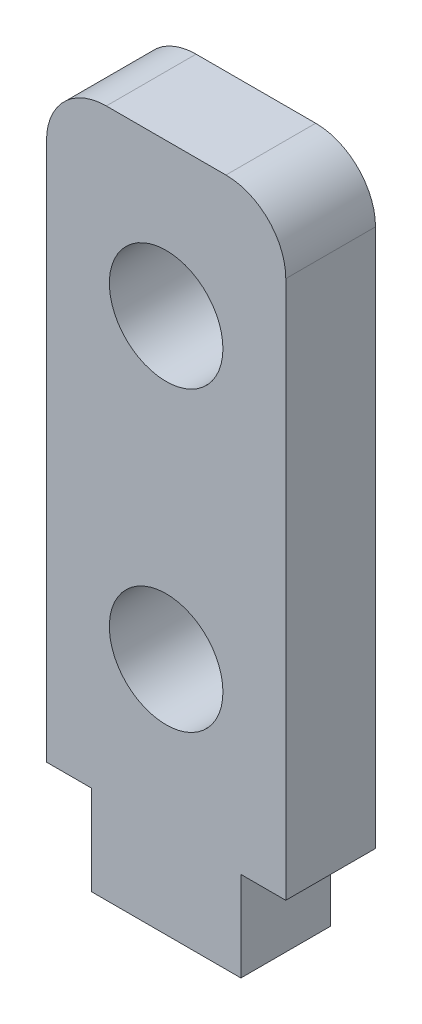
ISO-10303-21;
HEADER;
FILE_DESCRIPTION(('STEP AP214'),'2;1');
FILE_NAME('part.step','',(''),(''),'','','');
FILE_SCHEMA(('AUTOMOTIVE_DESIGN { 1 0 10303 214 1 1 1 1 }'));
ENDSEC;
DATA;
#1=APPLICATION_CONTEXT('core data for automotive mechanical design processes');
#2=APPLICATION_PROTOCOL_DEFINITION('international standard','automotive_design',2000,#1);
#3=PRODUCT_CONTEXT('',#1,'mechanical');
#4=PRODUCT('Part','Part','',(#3));
#5=PRODUCT_RELATED_PRODUCT_CATEGORY('part','',(#4));
#6=PRODUCT_DEFINITION_FORMATION('','',#4);
#7=PRODUCT_DEFINITION_CONTEXT('part definition',#1,'design');
#8=PRODUCT_DEFINITION('design','',#6,#7);
#9=PRODUCT_DEFINITION_SHAPE('','',#8);
#10=(LENGTH_UNIT() NAMED_UNIT(*) SI_UNIT(.MILLI.,.METRE.));
#11=(NAMED_UNIT(*) PLANE_ANGLE_UNIT() SI_UNIT($,.RADIAN.));
#12=(NAMED_UNIT(*) SI_UNIT($,.STERADIAN.) SOLID_ANGLE_UNIT());
#13=UNCERTAINTY_MEASURE_WITH_UNIT(LENGTH_MEASURE(1.E-05),#10,'distance_accuracy_value','');
#14=(GEOMETRIC_REPRESENTATION_CONTEXT(3) GLOBAL_UNCERTAINTY_ASSIGNED_CONTEXT((#13)) GLOBAL_UNIT_ASSIGNED_CONTEXT((#10,
#11,#12)) REPRESENTATION_CONTEXT('',''));
#15=CARTESIAN_POINT('',(0.,0.,0.));
#16=DIRECTION('',(0.,0.,1.));
#17=DIRECTION('',(1.,0.,0.));
#18=AXIS2_PLACEMENT_3D('',#15,#16,#17);
#19=CARTESIAN_POINT('',(4.,0.,3.));
#20=DIRECTION('',(1.,0.,0.));
#21=DIRECTION('',(0.,1.,0.));
#22=AXIS2_PLACEMENT_3D('',#19,#20,#21);
#23=PLANE('',#22);
#24=DIRECTION('',(0.,-1.,0.));
#25=VECTOR('',#24,1.);
#26=CARTESIAN_POINT('',(4.,0.,0.));
#27=LINE('',#26,#25);
#28=CARTESIAN_POINT('',(4.,21.,0.));
#29=VERTEX_POINT('',#28);
#30=CARTESIAN_POINT('',(4.,3.,0.));
#31=VERTEX_POINT('',#30);
#32=EDGE_CURVE('E151',#29,#31,#27,.T.);
#33=ORIENTED_EDGE('',*,*,#32,.F.);
#34=DIRECTION('',(0.,0.,-1.));
#35=VECTOR('',#34,1.);
#36=CARTESIAN_POINT('',(4.,21.,3.));
#37=LINE('',#36,#35);
#38=CARTESIAN_POINT('',(4.,21.,3.));
#39=VERTEX_POINT('',#38);
#40=EDGE_CURVE('E11',#29,#39,#37,.F.);
#41=ORIENTED_EDGE('',*,*,#40,.T.);
#42=DIRECTION('',(0.,-1.,0.));
#43=VECTOR('',#42,1.);
#44=CARTESIAN_POINT('',(4.,0.,3.));
#45=LINE('',#44,#43);
#46=CARTESIAN_POINT('',(4.,3.,3.));
#47=VERTEX_POINT('',#46);
#48=EDGE_CURVE('E192',#39,#47,#45,.T.);
#49=ORIENTED_EDGE('',*,*,#48,.T.);
#50=DIRECTION('',(0.,0.,-1.));
#51=VECTOR('',#50,1.);
#52=CARTESIAN_POINT('',(4.,3.,3.));
#53=LINE('',#52,#51);
#54=EDGE_CURVE('E138',#47,#31,#53,.T.);
#55=ORIENTED_EDGE('',*,*,#54,.T.);
#56=EDGE_LOOP('',(#33,#41,#49,#55));
#57=FACE_BOUND('',#56,.T.);
#58=ADVANCED_FACE('F32',(#57),#23,.T.);
#59=CARTESIAN_POINT('',(0.,23.,3.));
#60=DIRECTION('',(0.,1.,0.));
#61=DIRECTION('',(0.,0.,1.));
#62=AXIS2_PLACEMENT_3D('',#59,#60,#61);
#63=PLANE('',#62);
#64=DIRECTION('',(1.,0.,0.));
#65=VECTOR('',#64,1.);
#66=CARTESIAN_POINT('',(0.,23.,0.));
#67=LINE('',#66,#65);
#68=CARTESIAN_POINT('',(-2.,23.,0.));
#69=VERTEX_POINT('',#68);
#70=CARTESIAN_POINT('',(2.,23.,0.));
#71=VERTEX_POINT('',#70);
#72=EDGE_CURVE('E153',#69,#71,#67,.T.);
#73=ORIENTED_EDGE('',*,*,#72,.F.);
#74=DIRECTION('',(0.,0.,-1.));
#75=VECTOR('',#74,1.);
#76=CARTESIAN_POINT('',(-2.,23.,3.));
#77=LINE('',#76,#75);
#78=CARTESIAN_POINT('',(-2.,23.,3.));
#79=VERTEX_POINT('',#78);
#80=EDGE_CURVE('E184',#69,#79,#77,.F.);
#81=ORIENTED_EDGE('',*,*,#80,.T.);
#82=DIRECTION('',(1.,0.,0.));
#83=VECTOR('',#82,1.);
#84=CARTESIAN_POINT('',(0.,23.,3.));
#85=LINE('',#84,#83);
#86=CARTESIAN_POINT('',(2.,23.,3.));
#87=VERTEX_POINT('',#86);
#88=EDGE_CURVE('E117',#79,#87,#85,.T.);
#89=ORIENTED_EDGE('',*,*,#88,.T.);
#90=DIRECTION('',(0.,0.,-1.));
#91=VECTOR('',#90,1.);
#92=CARTESIAN_POINT('',(2.,23.,3.));
#93=LINE('',#92,#91);
#94=EDGE_CURVE('E181',#87,#71,#93,.T.);
#95=ORIENTED_EDGE('',*,*,#94,.T.);
#96=EDGE_LOOP('',(#73,#81,#89,#95));
#97=FACE_BOUND('',#96,.T.);
#98=ADVANCED_FACE('F189',(#97),#63,.T.);
#99=CARTESIAN_POINT('',(-4.,0.,3.));
#100=DIRECTION('',(1.,0.,0.));
#101=DIRECTION('',(0.,1.,0.));
#102=AXIS2_PLACEMENT_3D('',#99,#100,#101);
#103=PLANE('',#102);
#104=DIRECTION('',(0.,-1.,0.));
#105=VECTOR('',#104,1.);
#106=CARTESIAN_POINT('',(-4.,0.,3.));
#107=LINE('',#106,#105);
#108=CARTESIAN_POINT('',(-4.,21.,3.));
#109=VERTEX_POINT('',#108);
#110=CARTESIAN_POINT('',(-4.,3.,3.));
#111=VERTEX_POINT('',#110);
#112=EDGE_CURVE('E107',#109,#111,#107,.T.);
#113=ORIENTED_EDGE('',*,*,#112,.F.);
#114=DIRECTION('',(0.,0.,-1.));
#115=VECTOR('',#114,1.);
#116=CARTESIAN_POINT('',(-4.,21.,0.));
#117=LINE('',#116,#115);
#118=CARTESIAN_POINT('',(-4.,21.,0.));
#119=VERTEX_POINT('',#118);
#120=EDGE_CURVE('E126',#109,#119,#117,.T.);
#121=ORIENTED_EDGE('',*,*,#120,.T.);
#122=DIRECTION('',(0.,-1.,0.));
#123=VECTOR('',#122,1.);
#124=CARTESIAN_POINT('',(-4.,0.,0.));
#125=LINE('',#124,#123);
#126=CARTESIAN_POINT('',(-4.,3.,0.));
#127=VERTEX_POINT('',#126);
#128=EDGE_CURVE('E123',#119,#127,#125,.T.);
#129=ORIENTED_EDGE('',*,*,#128,.T.);
#130=DIRECTION('',(0.,0.,-1.));
#131=VECTOR('',#130,1.);
#132=CARTESIAN_POINT('',(-4.,3.,3.));
#133=LINE('',#132,#131);
#134=EDGE_CURVE('E120',#111,#127,#133,.T.);
#135=ORIENTED_EDGE('',*,*,#134,.F.);
#136=EDGE_LOOP('',(#113,#121,#129,#135));
#137=FACE_BOUND('',#136,.T.);
#138=ADVANCED_FACE('F121',(#137),#103,.F.);
#139=CARTESIAN_POINT('',(0.,3.,3.));
#140=DIRECTION('',(0.,1.,0.));
#141=DIRECTION('',(0.,0.,1.));
#142=AXIS2_PLACEMENT_3D('',#139,#140,#141);
#143=PLANE('',#142);
#144=DIRECTION('',(1.,0.,0.));
#145=VECTOR('',#144,1.);
#146=CARTESIAN_POINT('',(0.,3.,0.));
#147=LINE('',#146,#145);
#148=CARTESIAN_POINT('',(-2.5,3.,0.));
#149=VERTEX_POINT('',#148);
#150=EDGE_CURVE('E158',#127,#149,#147,.T.);
#151=ORIENTED_EDGE('',*,*,#150,.T.);
#152=DIRECTION('',(0.,0.,-1.));
#153=VECTOR('',#152,1.);
#154=CARTESIAN_POINT('',(-2.5,3.,3.));
#155=LINE('',#154,#153);
#156=CARTESIAN_POINT('',(-2.5,3.,3.));
#157=VERTEX_POINT('',#156);
#158=EDGE_CURVE('E127',#157,#149,#155,.T.);
#159=ORIENTED_EDGE('',*,*,#158,.F.);
#160=DIRECTION('',(1.,0.,0.));
#161=VECTOR('',#160,1.);
#162=CARTESIAN_POINT('',(0.,3.,3.));
#163=LINE('',#162,#161);
#164=EDGE_CURVE('E111',#111,#157,#163,.T.);
#165=ORIENTED_EDGE('',*,*,#164,.F.);
#166=ORIENTED_EDGE('',*,*,#134,.T.);
#167=EDGE_LOOP('',(#151,#159,#165,#166));
#168=FACE_BOUND('',#167,.T.);
#169=ADVANCED_FACE('F129',(#168),#143,.F.);
#170=CARTESIAN_POINT('',(-2.5,0.,3.));
#171=DIRECTION('',(1.,0.,0.));
#172=DIRECTION('',(0.,1.,0.));
#173=AXIS2_PLACEMENT_3D('',#170,#171,#172);
#174=PLANE('',#173);
#175=DIRECTION('',(0.,-1.,0.));
#176=VECTOR('',#175,1.);
#177=CARTESIAN_POINT('',(-2.5,0.,0.));
#178=LINE('',#177,#176);
#179=CARTESIAN_POINT('',(-2.5,0.,0.));
#180=VERTEX_POINT('',#179);
#181=EDGE_CURVE('E160',#149,#180,#178,.T.);
#182=ORIENTED_EDGE('',*,*,#181,.T.);
#183=DIRECTION('',(0.,0.,-1.));
#184=VECTOR('',#183,1.);
#185=CARTESIAN_POINT('',(-2.5,0.,3.));
#186=LINE('',#185,#184);
#187=CARTESIAN_POINT('',(-2.5,0.,3.));
#188=VERTEX_POINT('',#187);
#189=EDGE_CURVE('E172',#188,#180,#186,.T.);
#190=ORIENTED_EDGE('',*,*,#189,.F.);
#191=DIRECTION('',(0.,-1.,0.));
#192=VECTOR('',#191,1.);
#193=CARTESIAN_POINT('',(-2.5,0.,3.));
#194=LINE('',#193,#192);
#195=EDGE_CURVE('E132',#157,#188,#194,.T.);
#196=ORIENTED_EDGE('',*,*,#195,.F.);
#197=ORIENTED_EDGE('',*,*,#158,.T.);
#198=EDGE_LOOP('',(#182,#190,#196,#197));
#199=FACE_BOUND('',#198,.T.);
#200=ADVANCED_FACE('F200',(#199),#174,.F.);
#201=CARTESIAN_POINT('',(0.,0.,3.));
#202=DIRECTION('',(0.,1.,0.));
#203=DIRECTION('',(0.,0.,1.));
#204=AXIS2_PLACEMENT_3D('',#201,#202,#203);
#205=PLANE('',#204);
#206=DIRECTION('',(1.,0.,0.));
#207=VECTOR('',#206,1.);
#208=CARTESIAN_POINT('',(0.,0.,0.));
#209=LINE('',#208,#207);
#210=CARTESIAN_POINT('',(2.5,0.,0.));
#211=VERTEX_POINT('',#210);
#212=EDGE_CURVE('E163',#180,#211,#209,.T.);
#213=ORIENTED_EDGE('',*,*,#212,.T.);
#214=DIRECTION('',(0.,0.,-1.));
#215=VECTOR('',#214,1.);
#216=CARTESIAN_POINT('',(2.5,0.,3.));
#217=LINE('',#216,#215);
#218=CARTESIAN_POINT('',(2.5,0.,3.));
#219=VERTEX_POINT('',#218);
#220=EDGE_CURVE('E170',#219,#211,#217,.T.);
#221=ORIENTED_EDGE('',*,*,#220,.F.);
#222=DIRECTION('',(1.,0.,0.));
#223=VECTOR('',#222,1.);
#224=CARTESIAN_POINT('',(0.,0.,3.));
#225=LINE('',#224,#223);
#226=EDGE_CURVE('E135',#188,#219,#225,.T.);
#227=ORIENTED_EDGE('',*,*,#226,.F.);
#228=ORIENTED_EDGE('',*,*,#189,.T.);
#229=EDGE_LOOP('',(#213,#221,#227,#228));
#230=FACE_BOUND('',#229,.T.);
#231=ADVANCED_FACE('F205',(#230),#205,.F.);
#232=CARTESIAN_POINT('',(2.5,0.,3.));
#233=DIRECTION('',(1.,0.,0.));
#234=DIRECTION('',(0.,1.,0.));
#235=AXIS2_PLACEMENT_3D('',#232,#233,#234);
#236=PLANE('',#235);
#237=DIRECTION('',(0.,-1.,0.));
#238=VECTOR('',#237,1.);
#239=CARTESIAN_POINT('',(2.5,0.,0.));
#240=LINE('',#239,#238);
#241=CARTESIAN_POINT('',(2.5,3.,0.));
#242=VERTEX_POINT('',#241);
#243=EDGE_CURVE('E166',#242,#211,#240,.T.);
#244=ORIENTED_EDGE('',*,*,#243,.F.);
#245=DIRECTION('',(0.,0.,-1.));
#246=VECTOR('',#245,1.);
#247=CARTESIAN_POINT('',(2.5,3.,3.));
#248=LINE('',#247,#246);
#249=CARTESIAN_POINT('',(2.5,3.,3.));
#250=VERTEX_POINT('',#249);
#251=EDGE_CURVE('E144',#250,#242,#248,.T.);
#252=ORIENTED_EDGE('',*,*,#251,.F.);
#253=DIRECTION('',(0.,-1.,0.));
#254=VECTOR('',#253,1.);
#255=CARTESIAN_POINT('',(2.5,0.,3.));
#256=LINE('',#255,#254);
#257=EDGE_CURVE('E139',#250,#219,#256,.T.);
#258=ORIENTED_EDGE('',*,*,#257,.T.);
#259=ORIENTED_EDGE('',*,*,#220,.T.);
#260=EDGE_LOOP('',(#244,#252,#258,#259));
#261=FACE_BOUND('',#260,.T.);
#262=ADVANCED_FACE('F207',(#261),#236,.T.);
#263=EDGE_CURVE('E161',#242,#31,#147,.T.);
#264=ORIENTED_EDGE('',*,*,#263,.T.);
#265=ORIENTED_EDGE('',*,*,#54,.F.);
#266=EDGE_CURVE('E134',#250,#47,#163,.T.);
#267=ORIENTED_EDGE('',*,*,#266,.F.);
#268=ORIENTED_EDGE('',*,*,#251,.T.);
#269=EDGE_LOOP('',(#264,#265,#267,#268));
#270=FACE_BOUND('',#269,.T.);
#271=ADVANCED_FACE('F229',(#270),#143,.F.);
#272=CARTESIAN_POINT('',(0.,0.,3.));
#273=DIRECTION('',(0.,0.,1.));
#274=DIRECTION('',(1.,0.,0.));
#275=AXIS2_PLACEMENT_3D('',#272,#273,#274);
#276=PLANE('',#275);
#277=CARTESIAN_POINT('',(0.,17.92,3.));
#278=DIRECTION('',(0.,0.,1.));
#279=DIRECTION('',(1.,0.,0.));
#280=AXIS2_PLACEMENT_3D('',#277,#278,#279);
#281=CIRCLE('',#280,1.89864999999999);
#282=CARTESIAN_POINT('',(1.89864999999999,17.92,3.));
#283=VERTEX_POINT('',#282);
#284=EDGE_CURVE('E221',#283,#283,#281,.T.);
#285=ORIENTED_EDGE('',*,*,#284,.F.);
#286=EDGE_LOOP('',(#285));
#287=FACE_BOUND('',#286,.T.);
#288=CARTESIAN_POINT('',(0.,7.98,3.));
#289=DIRECTION('',(0.,0.,1.));
#290=DIRECTION('',(1.,0.,0.));
#291=AXIS2_PLACEMENT_3D('',#288,#289,#290);
#292=CIRCLE('',#291,1.89864999999999);
#293=CARTESIAN_POINT('',(1.89864999999999,7.98,3.));
#294=VERTEX_POINT('',#293);
#295=EDGE_CURVE('E215',#294,#294,#292,.T.);
#296=ORIENTED_EDGE('',*,*,#295,.F.);
#297=EDGE_LOOP('',(#296));
#298=FACE_BOUND('',#297,.T.);
#299=ORIENTED_EDGE('',*,*,#88,.F.);
#300=CARTESIAN_POINT('',(-2.,21.,3.));
#301=DIRECTION('',(0.,0.,1.));
#302=DIRECTION('',(1.,0.,0.));
#303=AXIS2_PLACEMENT_3D('',#300,#301,#302);
#304=CIRCLE('',#303,2.);
#305=EDGE_CURVE('E40',#79,#109,#304,.T.);
#306=ORIENTED_EDGE('',*,*,#305,.T.);
#307=ORIENTED_EDGE('',*,*,#112,.T.);
#308=ORIENTED_EDGE('',*,*,#164,.T.);
#309=ORIENTED_EDGE('',*,*,#195,.T.);
#310=ORIENTED_EDGE('',*,*,#226,.T.);
#311=ORIENTED_EDGE('',*,*,#257,.F.);
#312=ORIENTED_EDGE('',*,*,#266,.T.);
#313=ORIENTED_EDGE('',*,*,#48,.F.);
#314=CARTESIAN_POINT('',(2.,21.,3.));
#315=DIRECTION('',(0.,0.,1.));
#316=DIRECTION('',(1.,0.,0.));
#317=AXIS2_PLACEMENT_3D('',#314,#315,#316);
#318=CIRCLE('',#317,2.);
#319=EDGE_CURVE('E52',#39,#87,#318,.T.);
#320=ORIENTED_EDGE('',*,*,#319,.T.);
#321=EDGE_LOOP('',(#299,#306,#307,#308,#309,#310,#311,#312,#313,#320));
#322=FACE_BOUND('',#321,.T.);
#323=ADVANCED_FACE('F109',(#287,#298,#322),#276,.T.);
#324=CARTESIAN_POINT('',(0.,0.,0.));
#325=DIRECTION('',(0.,0.,1.));
#326=DIRECTION('',(1.,0.,0.));
#327=AXIS2_PLACEMENT_3D('',#324,#325,#326);
#328=PLANE('',#327);
#329=CARTESIAN_POINT('',(0.,17.92,0.));
#330=DIRECTION('',(0.,0.,1.));
#331=DIRECTION('',(1.,0.,0.));
#332=AXIS2_PLACEMENT_3D('',#329,#330,#331);
#333=CIRCLE('',#332,1.89864999999999);
#334=CARTESIAN_POINT('',(1.89864999999999,17.92,0.));
#335=VERTEX_POINT('',#334);
#336=EDGE_CURVE('E218',#335,#335,#333,.T.);
#337=ORIENTED_EDGE('',*,*,#336,.T.);
#338=EDGE_LOOP('',(#337));
#339=FACE_BOUND('',#338,.T.);
#340=CARTESIAN_POINT('',(0.,7.98,0.));
#341=DIRECTION('',(0.,0.,1.));
#342=DIRECTION('',(1.,0.,0.));
#343=AXIS2_PLACEMENT_3D('',#340,#341,#342);
#344=CIRCLE('',#343,1.89864999999999);
#345=CARTESIAN_POINT('',(1.89864999999999,7.98,0.));
#346=VERTEX_POINT('',#345);
#347=EDGE_CURVE('E154',#346,#346,#344,.T.);
#348=ORIENTED_EDGE('',*,*,#347,.T.);
#349=EDGE_LOOP('',(#348));
#350=FACE_BOUND('',#349,.T.);
#351=ORIENTED_EDGE('',*,*,#128,.F.);
#352=CARTESIAN_POINT('',(-2.,21.,0.));
#353=DIRECTION('',(0.,0.,1.));
#354=DIRECTION('',(1.,0.,0.));
#355=AXIS2_PLACEMENT_3D('',#352,#353,#354);
#356=CIRCLE('',#355,2.);
#357=EDGE_CURVE('E179',#119,#69,#356,.F.);
#358=ORIENTED_EDGE('',*,*,#357,.T.);
#359=ORIENTED_EDGE('',*,*,#72,.T.);
#360=CARTESIAN_POINT('',(2.,21.,0.));
#361=DIRECTION('',(0.,0.,1.));
#362=DIRECTION('',(1.,0.,0.));
#363=AXIS2_PLACEMENT_3D('',#360,#361,#362);
#364=CIRCLE('',#363,2.);
#365=EDGE_CURVE('E177',#71,#29,#364,.F.);
#366=ORIENTED_EDGE('',*,*,#365,.T.);
#367=ORIENTED_EDGE('',*,*,#32,.T.);
#368=ORIENTED_EDGE('',*,*,#263,.F.);
#369=ORIENTED_EDGE('',*,*,#243,.T.);
#370=ORIENTED_EDGE('',*,*,#212,.F.);
#371=ORIENTED_EDGE('',*,*,#181,.F.);
#372=ORIENTED_EDGE('',*,*,#150,.F.);
#373=EDGE_LOOP('',(#351,#358,#359,#366,#367,#368,#369,#370,#371,#372));
#374=FACE_BOUND('',#373,.T.);
#375=ADVANCED_FACE('F196',(#339,#350,#374),#328,.F.);
#376=CARTESIAN_POINT('',(0.,7.98,3.));
#377=DIRECTION('',(0.,0.,1.));
#378=DIRECTION('',(1.,0.,0.));
#379=AXIS2_PLACEMENT_3D('',#376,#377,#378);
#380=CYLINDRICAL_SURFACE('',#379,1.89864999999999);
#381=ORIENTED_EDGE('',*,*,#347,.F.);
#382=EDGE_LOOP('',(#381));
#383=FACE_BOUND('',#382,.T.);
#384=ORIENTED_EDGE('',*,*,#295,.T.);
#385=EDGE_LOOP('',(#384));
#386=FACE_BOUND('',#385,.T.);
#387=ADVANCED_FACE('F233',(#383,#386),#380,.F.);
#388=CARTESIAN_POINT('',(0.,17.92,3.));
#389=DIRECTION('',(0.,0.,1.));
#390=DIRECTION('',(1.,0.,0.));
#391=AXIS2_PLACEMENT_3D('',#388,#389,#390);
#392=CYLINDRICAL_SURFACE('',#391,1.89864999999999);
#393=ORIENTED_EDGE('',*,*,#336,.F.);
#394=EDGE_LOOP('',(#393));
#395=FACE_BOUND('',#394,.T.);
#396=ORIENTED_EDGE('',*,*,#284,.T.);
#397=EDGE_LOOP('',(#396));
#398=FACE_BOUND('',#397,.T.);
#399=ADVANCED_FACE('F225',(#395,#398),#392,.F.);
#400=CARTESIAN_POINT('',(-2.,21.,3.));
#401=DIRECTION('',(0.,0.,1.));
#402=DIRECTION('',(1.,0.,0.));
#403=AXIS2_PLACEMENT_3D('',#400,#401,#402);
#404=CYLINDRICAL_SURFACE('',#403,2.);
#405=ORIENTED_EDGE('',*,*,#305,.F.);
#406=ORIENTED_EDGE('',*,*,#80,.F.);
#407=ORIENTED_EDGE('',*,*,#357,.F.);
#408=ORIENTED_EDGE('',*,*,#120,.F.);
#409=EDGE_LOOP('',(#405,#406,#407,#408));
#410=FACE_BOUND('',#409,.T.);
#411=ADVANCED_FACE('F194',(#410),#404,.T.);
#412=CARTESIAN_POINT('',(2.,21.,3.));
#413=DIRECTION('',(0.,0.,-1.));
#414=DIRECTION('',(-1.,0.,0.));
#415=AXIS2_PLACEMENT_3D('',#412,#413,#414);
#416=CYLINDRICAL_SURFACE('',#415,2.);
#417=ORIENTED_EDGE('',*,*,#319,.F.);
#418=ORIENTED_EDGE('',*,*,#40,.F.);
#419=ORIENTED_EDGE('',*,*,#365,.F.);
#420=ORIENTED_EDGE('',*,*,#94,.F.);
#421=EDGE_LOOP('',(#417,#418,#419,#420));
#422=FACE_BOUND('',#421,.T.);
#423=ADVANCED_FACE('F34',(#422),#416,.T.);
#424=CLOSED_SHELL('',(#58,#98,#138,#169,#200,#231,#262,#271,#323,#375,#387,#399,#411,#423));
#425=MANIFOLD_SOLID_BREP('B2',#424);
#426=ADVANCED_BREP_SHAPE_REPRESENTATION('',(#18,#425),#14);
#427=SHAPE_DEFINITION_REPRESENTATION(#9,#426);
ENDSEC;
END-ISO-10303-21;
